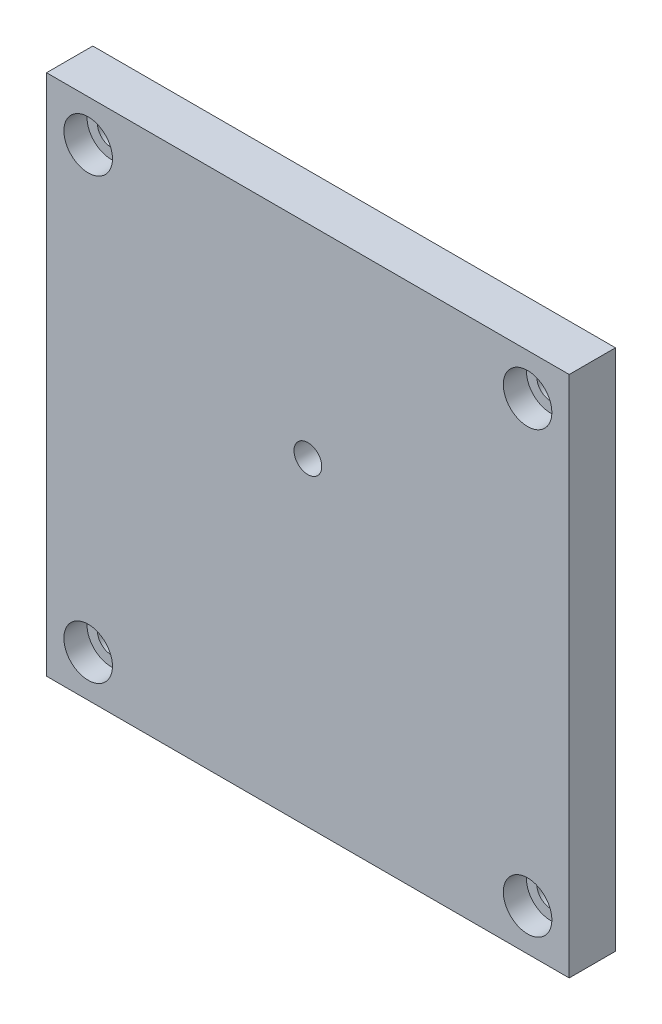
ISO-10303-21;
HEADER;
FILE_DESCRIPTION(('STEP AP214'),'2;1');
FILE_NAME('part.step','',(''),(''),'','','');
FILE_SCHEMA(('AUTOMOTIVE_DESIGN { 1 0 10303 214 1 1 1 1 }'));
ENDSEC;
DATA;
#1=APPLICATION_CONTEXT('core data for automotive mechanical design processes');
#2=APPLICATION_PROTOCOL_DEFINITION('international standard','automotive_design',2000,#1);
#3=PRODUCT_CONTEXT('',#1,'mechanical');
#4=PRODUCT('Part','Part','',(#3));
#5=PRODUCT_RELATED_PRODUCT_CATEGORY('part','',(#4));
#6=PRODUCT_DEFINITION_FORMATION('','',#4);
#7=PRODUCT_DEFINITION_CONTEXT('part definition',#1,'design');
#8=PRODUCT_DEFINITION('design','',#6,#7);
#9=PRODUCT_DEFINITION_SHAPE('','',#8);
#10=(LENGTH_UNIT() NAMED_UNIT(*) SI_UNIT(.MILLI.,.METRE.));
#11=(NAMED_UNIT(*) PLANE_ANGLE_UNIT() SI_UNIT($,.RADIAN.));
#12=(NAMED_UNIT(*) SI_UNIT($,.STERADIAN.) SOLID_ANGLE_UNIT());
#13=UNCERTAINTY_MEASURE_WITH_UNIT(LENGTH_MEASURE(1.E-05),#10,'distance_accuracy_value','');
#14=(GEOMETRIC_REPRESENTATION_CONTEXT(3) GLOBAL_UNCERTAINTY_ASSIGNED_CONTEXT((#13)) GLOBAL_UNIT_ASSIGNED_CONTEXT((#10,
#11,#12)) REPRESENTATION_CONTEXT('',''));
#15=CARTESIAN_POINT('',(0.,0.,0.));
#16=DIRECTION('',(0.,0.,1.));
#17=DIRECTION('',(1.,0.,0.));
#18=AXIS2_PLACEMENT_3D('',#15,#16,#17);
#19=CARTESIAN_POINT('',(-24.13,24.13,86.2615153344651));
#20=DIRECTION('',(0.,0.,-1.));
#21=DIRECTION('',(-1.,0.,0.));
#22=AXIS2_PLACEMENT_3D('',#19,#20,#21);
#23=CYLINDRICAL_SURFACE('',#22,1.524);
#24=CARTESIAN_POINT('',(-24.13,24.13,0.));
#25=DIRECTION('',(0.,0.,1.));
#26=DIRECTION('',(1.,0.,0.));
#27=AXIS2_PLACEMENT_3D('',#24,#25,#26);
#28=CIRCLE('',#27,1.524);
#29=CARTESIAN_POINT('',(-22.606,24.13,0.));
#30=VERTEX_POINT('',#29);
#31=EDGE_CURVE('E103',#30,#30,#28,.T.);
#32=ORIENTED_EDGE('',*,*,#31,.F.);
#33=EDGE_LOOP('',(#32));
#34=FACE_BOUND('',#33,.T.);
#35=CARTESIAN_POINT('',(-24.13,24.13,2.54));
#36=DIRECTION('',(0.,0.,1.));
#37=DIRECTION('',(1.,0.,0.));
#38=AXIS2_PLACEMENT_3D('',#35,#36,#37);
#39=CIRCLE('',#38,1.524);
#40=CARTESIAN_POINT('',(-22.606,24.13,2.54));
#41=VERTEX_POINT('',#40);
#42=EDGE_CURVE('E37',#41,#41,#39,.T.);
#43=ORIENTED_EDGE('',*,*,#42,.T.);
#44=EDGE_LOOP('',(#43));
#45=FACE_BOUND('',#44,.T.);
#46=ADVANCED_FACE('F33',(#34,#45),#23,.F.);
#47=CARTESIAN_POINT('',(24.13,-24.13,86.2615153344651));
#48=DIRECTION('',(0.,0.,-1.));
#49=DIRECTION('',(-1.,0.,0.));
#50=AXIS2_PLACEMENT_3D('',#47,#48,#49);
#51=CYLINDRICAL_SURFACE('',#50,1.524);
#52=CARTESIAN_POINT('',(24.13,-24.13,0.));
#53=DIRECTION('',(0.,0.,1.));
#54=DIRECTION('',(1.,0.,0.));
#55=AXIS2_PLACEMENT_3D('',#52,#53,#54);
#56=CIRCLE('',#55,1.524);
#57=CARTESIAN_POINT('',(25.654,-24.13,0.));
#58=VERTEX_POINT('',#57);
#59=EDGE_CURVE('E107',#58,#58,#56,.T.);
#60=ORIENTED_EDGE('',*,*,#59,.F.);
#61=EDGE_LOOP('',(#60));
#62=FACE_BOUND('',#61,.T.);
#63=CARTESIAN_POINT('',(24.13,-24.13,2.54));
#64=DIRECTION('',(0.,0.,1.));
#65=DIRECTION('',(1.,0.,0.));
#66=AXIS2_PLACEMENT_3D('',#63,#64,#65);
#67=CIRCLE('',#66,1.524);
#68=CARTESIAN_POINT('',(25.654,-24.13,2.54));
#69=VERTEX_POINT('',#68);
#70=EDGE_CURVE('E128',#69,#69,#67,.T.);
#71=ORIENTED_EDGE('',*,*,#70,.T.);
#72=EDGE_LOOP('',(#71));
#73=FACE_BOUND('',#72,.T.);
#74=ADVANCED_FACE('F164',(#62,#73),#51,.F.);
#75=CARTESIAN_POINT('',(24.13,24.13,86.2615153344651));
#76=DIRECTION('',(0.,0.,-1.));
#77=DIRECTION('',(-1.,0.,0.));
#78=AXIS2_PLACEMENT_3D('',#75,#76,#77);
#79=CYLINDRICAL_SURFACE('',#78,1.524);
#80=CARTESIAN_POINT('',(24.13,24.13,0.));
#81=DIRECTION('',(0.,0.,1.));
#82=DIRECTION('',(1.,0.,0.));
#83=AXIS2_PLACEMENT_3D('',#80,#81,#82);
#84=CIRCLE('',#83,1.524);
#85=CARTESIAN_POINT('',(25.654,24.13,0.));
#86=VERTEX_POINT('',#85);
#87=EDGE_CURVE('E110',#86,#86,#84,.T.);
#88=ORIENTED_EDGE('',*,*,#87,.F.);
#89=EDGE_LOOP('',(#88));
#90=FACE_BOUND('',#89,.T.);
#91=CARTESIAN_POINT('',(24.13,24.13,2.54));
#92=DIRECTION('',(0.,0.,1.));
#93=DIRECTION('',(1.,0.,0.));
#94=AXIS2_PLACEMENT_3D('',#91,#92,#93);
#95=CIRCLE('',#94,1.524);
#96=CARTESIAN_POINT('',(25.654,24.13,2.54));
#97=VERTEX_POINT('',#96);
#98=EDGE_CURVE('E126',#97,#97,#95,.T.);
#99=ORIENTED_EDGE('',*,*,#98,.T.);
#100=EDGE_LOOP('',(#99));
#101=FACE_BOUND('',#100,.T.);
#102=ADVANCED_FACE('F170',(#90,#101),#79,.F.);
#103=CARTESIAN_POINT('',(-24.13,-24.13,86.2615153344651));
#104=DIRECTION('',(0.,0.,-1.));
#105=DIRECTION('',(-1.,0.,0.));
#106=AXIS2_PLACEMENT_3D('',#103,#104,#105);
#107=CYLINDRICAL_SURFACE('',#106,1.524);
#108=CARTESIAN_POINT('',(-24.13,-24.13,0.));
#109=DIRECTION('',(0.,0.,1.));
#110=DIRECTION('',(1.,0.,0.));
#111=AXIS2_PLACEMENT_3D('',#108,#109,#110);
#112=CIRCLE('',#111,1.524);
#113=CARTESIAN_POINT('',(-22.606,-24.13,0.));
#114=VERTEX_POINT('',#113);
#115=EDGE_CURVE('E106',#114,#114,#112,.T.);
#116=ORIENTED_EDGE('',*,*,#115,.F.);
#117=EDGE_LOOP('',(#116));
#118=FACE_BOUND('',#117,.T.);
#119=CARTESIAN_POINT('',(-24.13,-24.13,2.54));
#120=DIRECTION('',(0.,0.,1.));
#121=DIRECTION('',(1.,0.,0.));
#122=AXIS2_PLACEMENT_3D('',#119,#120,#121);
#123=CIRCLE('',#122,1.524);
#124=CARTESIAN_POINT('',(-22.606,-24.13,2.54));
#125=VERTEX_POINT('',#124);
#126=EDGE_CURVE('E113',#125,#125,#123,.T.);
#127=ORIENTED_EDGE('',*,*,#126,.T.);
#128=EDGE_LOOP('',(#127));
#129=FACE_BOUND('',#128,.T.);
#130=ADVANCED_FACE('F175',(#118,#129),#107,.F.);
#131=CARTESIAN_POINT('',(0.,0.,0.));
#132=DIRECTION('',(0.,0.,-1.));
#133=DIRECTION('',(-1.,0.,0.));
#134=AXIS2_PLACEMENT_3D('',#131,#132,#133);
#135=PLANE('',#134);
#136=CARTESIAN_POINT('',(0.,6.35,0.));
#137=DIRECTION('',(0.,0.,1.));
#138=DIRECTION('',(1.,0.,0.));
#139=AXIS2_PLACEMENT_3D('',#136,#137,#138);
#140=CIRCLE('',#139,1.524);
#141=CARTESIAN_POINT('',(1.524,6.35,0.));
#142=VERTEX_POINT('',#141);
#143=EDGE_CURVE('E215',#142,#142,#140,.T.);
#144=ORIENTED_EDGE('',*,*,#143,.T.);
#145=EDGE_LOOP('',(#144));
#146=FACE_BOUND('',#145,.T.);
#147=ORIENTED_EDGE('',*,*,#59,.T.);
#148=EDGE_LOOP('',(#147));
#149=FACE_BOUND('',#148,.T.);
#150=ORIENTED_EDGE('',*,*,#31,.T.);
#151=EDGE_LOOP('',(#150));
#152=FACE_BOUND('',#151,.T.);
#153=DIRECTION('',(0.,-1.,0.));
#154=VECTOR('',#153,1.);
#155=CARTESIAN_POINT('',(-28.702,-28.702,0.));
#156=LINE('',#155,#154);
#157=CARTESIAN_POINT('',(-28.702,28.702,0.));
#158=VERTEX_POINT('',#157);
#159=CARTESIAN_POINT('',(-28.702,-28.702,0.));
#160=VERTEX_POINT('',#159);
#161=EDGE_CURVE('E91',#158,#160,#156,.T.);
#162=ORIENTED_EDGE('',*,*,#161,.F.);
#163=DIRECTION('',(-1.,0.,0.));
#164=VECTOR('',#163,1.);
#165=CARTESIAN_POINT('',(-28.702,28.702,0.));
#166=LINE('',#165,#164);
#167=CARTESIAN_POINT('',(28.702,28.702,0.));
#168=VERTEX_POINT('',#167);
#169=EDGE_CURVE('E11',#168,#158,#166,.T.);
#170=ORIENTED_EDGE('',*,*,#169,.F.);
#171=DIRECTION('',(0.,1.,0.));
#172=VECTOR('',#171,1.);
#173=CARTESIAN_POINT('',(28.702,-28.702,0.));
#174=LINE('',#173,#172);
#175=CARTESIAN_POINT('',(28.702,-28.702,0.));
#176=VERTEX_POINT('',#175);
#177=EDGE_CURVE('E92',#176,#168,#174,.T.);
#178=ORIENTED_EDGE('',*,*,#177,.F.);
#179=DIRECTION('',(1.,0.,0.));
#180=VECTOR('',#179,1.);
#181=CARTESIAN_POINT('',(-28.702,-28.702,0.));
#182=LINE('',#181,#180);
#183=EDGE_CURVE('E80',#160,#176,#182,.T.);
#184=ORIENTED_EDGE('',*,*,#183,.F.);
#185=EDGE_LOOP('',(#162,#170,#178,#184));
#186=FACE_BOUND('',#185,.T.);
#187=ORIENTED_EDGE('',*,*,#115,.T.);
#188=EDGE_LOOP('',(#187));
#189=FACE_BOUND('',#188,.T.);
#190=ORIENTED_EDGE('',*,*,#87,.T.);
#191=EDGE_LOOP('',(#190));
#192=FACE_BOUND('',#191,.T.);
#193=ADVANCED_FACE('F88',(#146,#149,#152,#186,#189,#192),#135,.T.);
#194=CARTESIAN_POINT('',(-28.702,-28.702,86.2615153344651));
#195=DIRECTION('',(1.,0.,0.));
#196=DIRECTION('',(0.,0.,-1.));
#197=AXIS2_PLACEMENT_3D('',#194,#195,#196);
#198=PLANE('',#197);
#199=DIRECTION('',(0.,0.,-1.));
#200=VECTOR('',#199,1.);
#201=CARTESIAN_POINT('',(-28.702,-28.702,86.2615153344651));
#202=LINE('',#201,#200);
#203=CARTESIAN_POINT('',(-28.702,-28.702,5.08));
#204=VERTEX_POINT('',#203);
#205=EDGE_CURVE('E77',#204,#160,#202,.T.);
#206=ORIENTED_EDGE('',*,*,#205,.F.);
#207=DIRECTION('',(0.,1.,0.));
#208=VECTOR('',#207,1.);
#209=CARTESIAN_POINT('',(-28.702,-28.702,5.08));
#210=LINE('',#209,#208);
#211=CARTESIAN_POINT('',(-28.702,28.702,5.08));
#212=VERTEX_POINT('',#211);
#213=EDGE_CURVE('E52',#204,#212,#210,.T.);
#214=ORIENTED_EDGE('',*,*,#213,.T.);
#215=DIRECTION('',(0.,0.,-1.));
#216=VECTOR('',#215,1.);
#217=CARTESIAN_POINT('',(-28.702,28.702,86.2615153344651));
#218=LINE('',#217,#216);
#219=EDGE_CURVE('E97',#212,#158,#218,.T.);
#220=ORIENTED_EDGE('',*,*,#219,.T.);
#221=ORIENTED_EDGE('',*,*,#161,.T.);
#222=EDGE_LOOP('',(#206,#214,#220,#221));
#223=FACE_BOUND('',#222,.T.);
#224=ADVANCED_FACE('F95',(#223),#198,.F.);
#225=CARTESIAN_POINT('',(-28.702,-28.702,86.2615153344651));
#226=DIRECTION('',(0.,1.,0.));
#227=DIRECTION('',(0.,0.,1.));
#228=AXIS2_PLACEMENT_3D('',#225,#226,#227);
#229=PLANE('',#228);
#230=DIRECTION('',(0.,0.,-1.));
#231=VECTOR('',#230,1.);
#232=CARTESIAN_POINT('',(28.702,-28.702,86.2615153344651));
#233=LINE('',#232,#231);
#234=CARTESIAN_POINT('',(28.702,-28.702,5.08));
#235=VERTEX_POINT('',#234);
#236=EDGE_CURVE('E72',#235,#176,#233,.T.);
#237=ORIENTED_EDGE('',*,*,#236,.F.);
#238=DIRECTION('',(-1.,0.,0.));
#239=VECTOR('',#238,1.);
#240=CARTESIAN_POINT('',(-28.702,-28.702,5.08));
#241=LINE('',#240,#239);
#242=EDGE_CURVE('E82',#235,#204,#241,.T.);
#243=ORIENTED_EDGE('',*,*,#242,.T.);
#244=ORIENTED_EDGE('',*,*,#205,.T.);
#245=ORIENTED_EDGE('',*,*,#183,.T.);
#246=EDGE_LOOP('',(#237,#243,#244,#245));
#247=FACE_BOUND('',#246,.T.);
#248=ADVANCED_FACE('F79',(#247),#229,.F.);
#249=CARTESIAN_POINT('',(28.702,-28.702,86.2615153344651));
#250=DIRECTION('',(-1.,0.,0.));
#251=DIRECTION('',(0.,0.,1.));
#252=AXIS2_PLACEMENT_3D('',#249,#250,#251);
#253=PLANE('',#252);
#254=DIRECTION('',(0.,0.,-1.));
#255=VECTOR('',#254,1.);
#256=CARTESIAN_POINT('',(28.702,28.702,86.2615153344651));
#257=LINE('',#256,#255);
#258=CARTESIAN_POINT('',(28.702,28.702,5.08));
#259=VERTEX_POINT('',#258);
#260=EDGE_CURVE('E43',#259,#168,#257,.T.);
#261=ORIENTED_EDGE('',*,*,#260,.F.);
#262=DIRECTION('',(0.,-1.,0.));
#263=VECTOR('',#262,1.);
#264=CARTESIAN_POINT('',(28.702,-28.702,5.08));
#265=LINE('',#264,#263);
#266=EDGE_CURVE('E93',#259,#235,#265,.T.);
#267=ORIENTED_EDGE('',*,*,#266,.T.);
#268=ORIENTED_EDGE('',*,*,#236,.T.);
#269=ORIENTED_EDGE('',*,*,#177,.T.);
#270=EDGE_LOOP('',(#261,#267,#268,#269));
#271=FACE_BOUND('',#270,.T.);
#272=ADVANCED_FACE('F145',(#271),#253,.F.);
#273=CARTESIAN_POINT('',(-28.702,28.702,86.2615153344651));
#274=DIRECTION('',(0.,-1.,0.));
#275=DIRECTION('',(0.,0.,-1.));
#276=AXIS2_PLACEMENT_3D('',#273,#274,#275);
#277=PLANE('',#276);
#278=ORIENTED_EDGE('',*,*,#219,.F.);
#279=DIRECTION('',(1.,0.,0.));
#280=VECTOR('',#279,1.);
#281=CARTESIAN_POINT('',(-28.702,28.702,5.08));
#282=LINE('',#281,#280);
#283=EDGE_CURVE('E117',#212,#259,#282,.T.);
#284=ORIENTED_EDGE('',*,*,#283,.T.);
#285=ORIENTED_EDGE('',*,*,#260,.T.);
#286=ORIENTED_EDGE('',*,*,#169,.T.);
#287=EDGE_LOOP('',(#278,#284,#285,#286));
#288=FACE_BOUND('',#287,.T.);
#289=ADVANCED_FACE('F147',(#288),#277,.F.);
#290=CARTESIAN_POINT('',(0.,0.,5.08));
#291=DIRECTION('',(0.,0.,-1.));
#292=DIRECTION('',(0.,-1.,0.));
#293=AXIS2_PLACEMENT_3D('',#290,#291,#292);
#294=PLANE('',#293);
#295=CARTESIAN_POINT('',(0.,6.35,5.08));
#296=DIRECTION('',(0.,0.,1.));
#297=DIRECTION('',(1.,0.,0.));
#298=AXIS2_PLACEMENT_3D('',#295,#296,#297);
#299=CIRCLE('',#298,1.524);
#300=CARTESIAN_POINT('',(1.524,6.35,5.08));
#301=VERTEX_POINT('',#300);
#302=EDGE_CURVE('E219',#301,#301,#299,.T.);
#303=ORIENTED_EDGE('',*,*,#302,.F.);
#304=EDGE_LOOP('',(#303));
#305=FACE_BOUND('',#304,.T.);
#306=CARTESIAN_POINT('',(-24.13,24.13,5.08));
#307=DIRECTION('',(0.,0.,1.));
#308=DIRECTION('',(1.,0.,0.));
#309=AXIS2_PLACEMENT_3D('',#306,#307,#308);
#310=CIRCLE('',#309,2.667);
#311=CARTESIAN_POINT('',(-21.463,24.13,5.08));
#312=VERTEX_POINT('',#311);
#313=EDGE_CURVE('E202',#312,#312,#310,.T.);
#314=ORIENTED_EDGE('',*,*,#313,.F.);
#315=EDGE_LOOP('',(#314));
#316=FACE_BOUND('',#315,.T.);
#317=CARTESIAN_POINT('',(24.13,24.13,5.08));
#318=DIRECTION('',(0.,0.,1.));
#319=DIRECTION('',(1.,0.,0.));
#320=AXIS2_PLACEMENT_3D('',#317,#318,#319);
#321=CIRCLE('',#320,2.667);
#322=CARTESIAN_POINT('',(26.797,24.13,5.08));
#323=VERTEX_POINT('',#322);
#324=EDGE_CURVE('E203',#323,#323,#321,.T.);
#325=ORIENTED_EDGE('',*,*,#324,.F.);
#326=EDGE_LOOP('',(#325));
#327=FACE_BOUND('',#326,.T.);
#328=CARTESIAN_POINT('',(24.13,-24.13,5.08));
#329=DIRECTION('',(0.,0.,1.));
#330=DIRECTION('',(1.,0.,0.));
#331=AXIS2_PLACEMENT_3D('',#328,#329,#330);
#332=CIRCLE('',#331,2.667);
#333=CARTESIAN_POINT('',(26.797,-24.13,5.08));
#334=VERTEX_POINT('',#333);
#335=EDGE_CURVE('E213',#334,#334,#332,.T.);
#336=ORIENTED_EDGE('',*,*,#335,.F.);
#337=EDGE_LOOP('',(#336));
#338=FACE_BOUND('',#337,.T.);
#339=CARTESIAN_POINT('',(-24.13,-24.13,5.08));
#340=DIRECTION('',(0.,0.,1.));
#341=DIRECTION('',(1.,0.,0.));
#342=AXIS2_PLACEMENT_3D('',#339,#340,#341);
#343=CIRCLE('',#342,2.667);
#344=CARTESIAN_POINT('',(-21.463,-24.13,5.08));
#345=VERTEX_POINT('',#344);
#346=EDGE_CURVE('E134',#345,#345,#343,.T.);
#347=ORIENTED_EDGE('',*,*,#346,.F.);
#348=EDGE_LOOP('',(#347));
#349=FACE_BOUND('',#348,.T.);
#350=ORIENTED_EDGE('',*,*,#242,.F.);
#351=ORIENTED_EDGE('',*,*,#266,.F.);
#352=ORIENTED_EDGE('',*,*,#283,.F.);
#353=ORIENTED_EDGE('',*,*,#213,.F.);
#354=EDGE_LOOP('',(#350,#351,#352,#353));
#355=FACE_BOUND('',#354,.T.);
#356=ADVANCED_FACE('F35',(#305,#316,#327,#338,#349,#355),#294,.F.);
#357=CARTESIAN_POINT('',(-24.13,-24.13,2.54));
#358=DIRECTION('',(0.,0.,1.));
#359=DIRECTION('',(1.,0.,0.));
#360=AXIS2_PLACEMENT_3D('',#357,#358,#359);
#361=CYLINDRICAL_SURFACE('',#360,2.667);
#362=CARTESIAN_POINT('',(-24.13,-24.13,2.54));
#363=DIRECTION('',(0.,0.,1.));
#364=DIRECTION('',(1.,0.,0.));
#365=AXIS2_PLACEMENT_3D('',#362,#363,#364);
#366=CIRCLE('',#365,2.667);
#367=CARTESIAN_POINT('',(-21.463,-24.13,2.54));
#368=VERTEX_POINT('',#367);
#369=EDGE_CURVE('E125',#368,#368,#366,.T.);
#370=ORIENTED_EDGE('',*,*,#369,.F.);
#371=EDGE_LOOP('',(#370));
#372=FACE_BOUND('',#371,.T.);
#373=ORIENTED_EDGE('',*,*,#346,.T.);
#374=EDGE_LOOP('',(#373));
#375=FACE_BOUND('',#374,.T.);
#376=ADVANCED_FACE('F149',(#372,#375),#361,.F.);
#377=CARTESIAN_POINT('',(-24.13,-24.13,2.54));
#378=DIRECTION('',(0.,0.,1.));
#379=DIRECTION('',(1.,0.,0.));
#380=AXIS2_PLACEMENT_3D('',#377,#378,#379);
#381=PLANE('',#380);
#382=ORIENTED_EDGE('',*,*,#126,.F.);
#383=EDGE_LOOP('',(#382));
#384=FACE_BOUND('',#383,.T.);
#385=ORIENTED_EDGE('',*,*,#369,.T.);
#386=EDGE_LOOP('',(#385));
#387=FACE_BOUND('',#386,.T.);
#388=ADVANCED_FACE('F156',(#384,#387),#381,.T.);
#389=CARTESIAN_POINT('',(24.13,-24.13,2.54));
#390=DIRECTION('',(0.,0.,1.));
#391=DIRECTION('',(1.,0.,0.));
#392=AXIS2_PLACEMENT_3D('',#389,#390,#391);
#393=CYLINDRICAL_SURFACE('',#392,2.667);
#394=CARTESIAN_POINT('',(24.13,-24.13,2.54));
#395=DIRECTION('',(0.,0.,1.));
#396=DIRECTION('',(1.,0.,0.));
#397=AXIS2_PLACEMENT_3D('',#394,#395,#396);
#398=CIRCLE('',#397,2.667);
#399=CARTESIAN_POINT('',(26.797,-24.13,2.54));
#400=VERTEX_POINT('',#399);
#401=EDGE_CURVE('E208',#400,#400,#398,.T.);
#402=ORIENTED_EDGE('',*,*,#401,.F.);
#403=EDGE_LOOP('',(#402));
#404=FACE_BOUND('',#403,.T.);
#405=ORIENTED_EDGE('',*,*,#335,.T.);
#406=EDGE_LOOP('',(#405));
#407=FACE_BOUND('',#406,.T.);
#408=ADVANCED_FACE('F245',(#404,#407),#393,.F.);
#409=CARTESIAN_POINT('',(24.13,-24.13,2.54));
#410=DIRECTION('',(0.,0.,1.));
#411=DIRECTION('',(1.,0.,0.));
#412=AXIS2_PLACEMENT_3D('',#409,#410,#411);
#413=PLANE('',#412);
#414=ORIENTED_EDGE('',*,*,#70,.F.);
#415=EDGE_LOOP('',(#414));
#416=FACE_BOUND('',#415,.T.);
#417=ORIENTED_EDGE('',*,*,#401,.T.);
#418=EDGE_LOOP('',(#417));
#419=FACE_BOUND('',#418,.T.);
#420=ADVANCED_FACE('F240',(#416,#419),#413,.T.);
#421=CARTESIAN_POINT('',(24.13,24.13,2.54));
#422=DIRECTION('',(0.,0.,1.));
#423=DIRECTION('',(1.,0.,0.));
#424=AXIS2_PLACEMENT_3D('',#421,#422,#423);
#425=CYLINDRICAL_SURFACE('',#424,2.667);
#426=CARTESIAN_POINT('',(24.13,24.13,2.54));
#427=DIRECTION('',(0.,0.,1.));
#428=DIRECTION('',(1.,0.,0.));
#429=AXIS2_PLACEMENT_3D('',#426,#427,#428);
#430=CIRCLE('',#429,2.667);
#431=CARTESIAN_POINT('',(26.797,24.13,2.54));
#432=VERTEX_POINT('',#431);
#433=EDGE_CURVE('E200',#432,#432,#430,.T.);
#434=ORIENTED_EDGE('',*,*,#433,.F.);
#435=EDGE_LOOP('',(#434));
#436=FACE_BOUND('',#435,.T.);
#437=ORIENTED_EDGE('',*,*,#324,.T.);
#438=EDGE_LOOP('',(#437));
#439=FACE_BOUND('',#438,.T.);
#440=ADVANCED_FACE('F196',(#436,#439),#425,.F.);
#441=CARTESIAN_POINT('',(24.13,24.13,2.54));
#442=DIRECTION('',(0.,0.,1.));
#443=DIRECTION('',(1.,0.,0.));
#444=AXIS2_PLACEMENT_3D('',#441,#442,#443);
#445=PLANE('',#444);
#446=ORIENTED_EDGE('',*,*,#98,.F.);
#447=EDGE_LOOP('',(#446));
#448=FACE_BOUND('',#447,.T.);
#449=ORIENTED_EDGE('',*,*,#433,.T.);
#450=EDGE_LOOP('',(#449));
#451=FACE_BOUND('',#450,.T.);
#452=ADVANCED_FACE('F192',(#448,#451),#445,.T.);
#453=CARTESIAN_POINT('',(-24.13,24.13,2.54));
#454=DIRECTION('',(0.,0.,1.));
#455=DIRECTION('',(1.,0.,0.));
#456=AXIS2_PLACEMENT_3D('',#453,#454,#455);
#457=CYLINDRICAL_SURFACE('',#456,2.667);
#458=CARTESIAN_POINT('',(-24.13,24.13,2.54));
#459=DIRECTION('',(0.,0.,1.));
#460=DIRECTION('',(1.,0.,0.));
#461=AXIS2_PLACEMENT_3D('',#458,#459,#460);
#462=CIRCLE('',#461,2.667);
#463=CARTESIAN_POINT('',(-21.463,24.13,2.54));
#464=VERTEX_POINT('',#463);
#465=EDGE_CURVE('E129',#464,#464,#462,.T.);
#466=ORIENTED_EDGE('',*,*,#465,.F.);
#467=EDGE_LOOP('',(#466));
#468=FACE_BOUND('',#467,.T.);
#469=ORIENTED_EDGE('',*,*,#313,.T.);
#470=EDGE_LOOP('',(#469));
#471=FACE_BOUND('',#470,.T.);
#472=ADVANCED_FACE('F195',(#468,#471),#457,.F.);
#473=CARTESIAN_POINT('',(-24.13,24.13,2.54));
#474=DIRECTION('',(0.,0.,1.));
#475=DIRECTION('',(1.,0.,0.));
#476=AXIS2_PLACEMENT_3D('',#473,#474,#475);
#477=PLANE('',#476);
#478=ORIENTED_EDGE('',*,*,#42,.F.);
#479=EDGE_LOOP('',(#478));
#480=FACE_BOUND('',#479,.T.);
#481=ORIENTED_EDGE('',*,*,#465,.T.);
#482=EDGE_LOOP('',(#481));
#483=FACE_BOUND('',#482,.T.);
#484=ADVANCED_FACE('F228',(#480,#483),#477,.T.);
#485=CARTESIAN_POINT('',(0.,6.35,0.));
#486=DIRECTION('',(0.,0.,1.));
#487=DIRECTION('',(1.,0.,0.));
#488=AXIS2_PLACEMENT_3D('',#485,#486,#487);
#489=CYLINDRICAL_SURFACE('',#488,1.524);
#490=ORIENTED_EDGE('',*,*,#143,.F.);
#491=EDGE_LOOP('',(#490));
#492=FACE_BOUND('',#491,.T.);
#493=ORIENTED_EDGE('',*,*,#302,.T.);
#494=EDGE_LOOP('',(#493));
#495=FACE_BOUND('',#494,.T.);
#496=ADVANCED_FACE('F267',(#492,#495),#489,.F.);
#497=CLOSED_SHELL('',(#46,#74,#102,#130,#193,#224,#248,#272,#289,#356,#376,#388,#408,#420,#440,
#452,#472,#484,#496));
#498=MANIFOLD_SOLID_BREP('B2',#497);
#499=ADVANCED_BREP_SHAPE_REPRESENTATION('',(#18,#498),#14);
#500=SHAPE_DEFINITION_REPRESENTATION(#9,#499);
ENDSEC;
END-ISO-10303-21;
